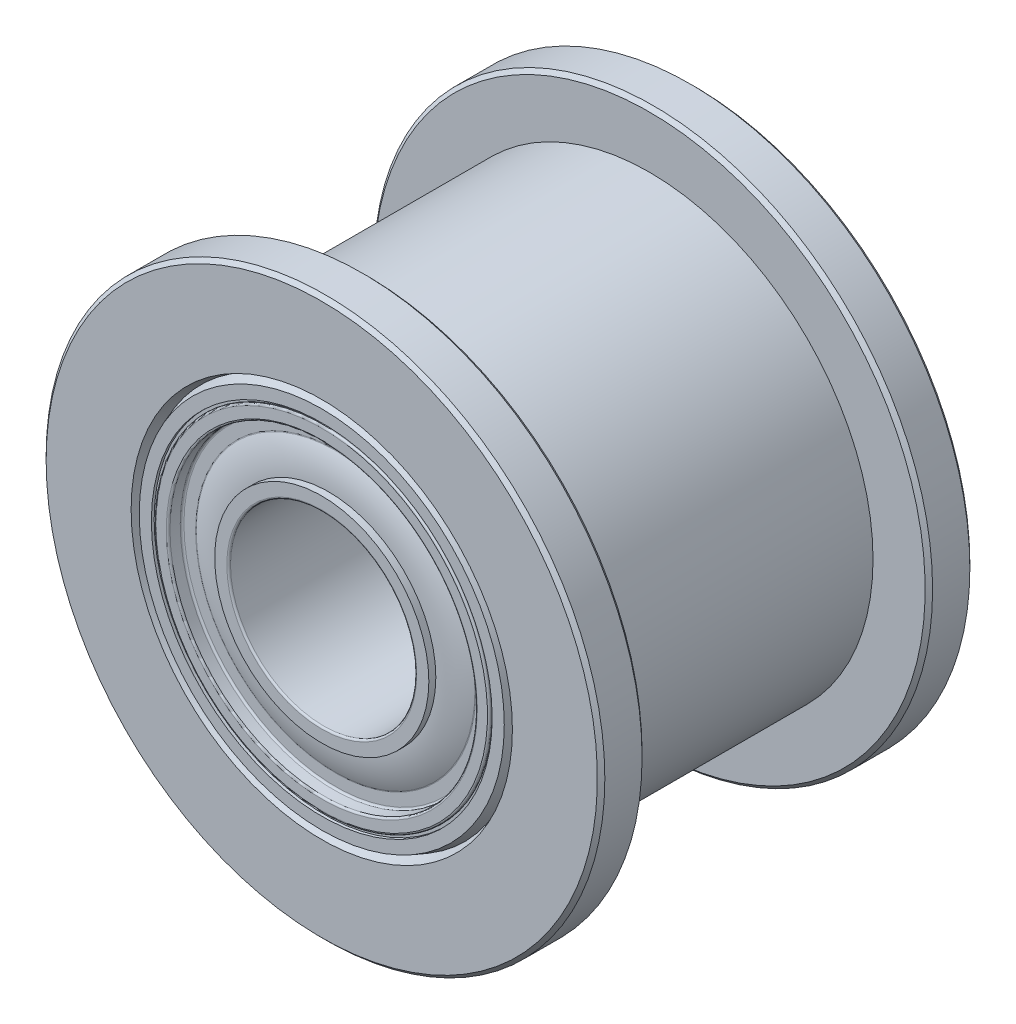
ISO-10303-21;
HEADER;
FILE_DESCRIPTION(('STEP AP214'),'2;1');
FILE_NAME('part.step','',(''),(''),'','','');
FILE_SCHEMA(('AUTOMOTIVE_DESIGN { 1 0 10303 214 1 1 1 1 }'));
ENDSEC;
DATA;
#1=APPLICATION_CONTEXT('core data for automotive mechanical design processes');
#2=APPLICATION_PROTOCOL_DEFINITION('international standard','automotive_design',2000,#1);
#3=PRODUCT_CONTEXT('',#1,'mechanical');
#4=PRODUCT('Part','Part','',(#3));
#5=PRODUCT_RELATED_PRODUCT_CATEGORY('part','',(#4));
#6=PRODUCT_DEFINITION_FORMATION('','',#4);
#7=PRODUCT_DEFINITION_CONTEXT('part definition',#1,'design');
#8=PRODUCT_DEFINITION('design','',#6,#7);
#9=PRODUCT_DEFINITION_SHAPE('','',#8);
#10=(LENGTH_UNIT() NAMED_UNIT(*) SI_UNIT(.MILLI.,.METRE.));
#11=(NAMED_UNIT(*) PLANE_ANGLE_UNIT() SI_UNIT($,.RADIAN.));
#12=(NAMED_UNIT(*) SI_UNIT($,.STERADIAN.) SOLID_ANGLE_UNIT());
#13=UNCERTAINTY_MEASURE_WITH_UNIT(LENGTH_MEASURE(1.E-05),#10,'distance_accuracy_value','');
#14=(GEOMETRIC_REPRESENTATION_CONTEXT(3) GLOBAL_UNCERTAINTY_ASSIGNED_CONTEXT((#13)) GLOBAL_UNIT_ASSIGNED_CONTEXT((#10,
#11,#12)) REPRESENTATION_CONTEXT('',''));
#15=CARTESIAN_POINT('',(0.,0.,0.));
#16=DIRECTION('',(0.,0.,1.));
#17=DIRECTION('',(1.,0.,0.));
#18=AXIS2_PLACEMENT_3D('',#15,#16,#17);
#19=CARTESIAN_POINT('',(0.,7.5,-3.8));
#20=DIRECTION('',(0.,0.,-1.));
#21=DIRECTION('',(-1.,0.,0.));
#22=AXIS2_PLACEMENT_3D('',#19,#20,#21);
#23=PLANE('',#22);
#24=CARTESIAN_POINT('',(0.,0.,-3.8));
#25=DIRECTION('',(0.,0.,-1.));
#26=DIRECTION('',(-1.,0.,0.));
#27=AXIS2_PLACEMENT_3D('',#24,#25,#26);
#28=CIRCLE('',#27,7.40000000000001);
#29=CARTESIAN_POINT('',(-7.4,0.,-3.8));
#30=VERTEX_POINT('',#29);
#31=EDGE_CURVE('E54',#30,#30,#28,.F.);
#32=ORIENTED_EDGE('',*,*,#31,.T.);
#33=EDGE_LOOP('',(#32));
#34=FACE_BOUND('',#33,.T.);
#35=CARTESIAN_POINT('',(0.,0.,-3.8));
#36=DIRECTION('',(0.,0.,1.));
#37=DIRECTION('',(1.,0.,0.));
#38=AXIS2_PLACEMENT_3D('',#35,#36,#37);
#39=CIRCLE('',#38,6.);
#40=CARTESIAN_POINT('',(6.,0.,-3.8));
#41=VERTEX_POINT('',#40);
#42=EDGE_CURVE('E85',#41,#41,#39,.T.);
#43=ORIENTED_EDGE('',*,*,#42,.F.);
#44=EDGE_LOOP('',(#43));
#45=FACE_BOUND('',#44,.T.);
#46=ADVANCED_FACE('F34',(#34,#45),#23,.F.);
#47=CARTESIAN_POINT('',(0.,0.,5.));
#48=DIRECTION('',(0.,0.,1.));
#49=DIRECTION('',(1.,0.,0.));
#50=AXIS2_PLACEMENT_3D('',#47,#48,#49);
#51=CYLINDRICAL_SURFACE('',#50,7.5);
#52=CARTESIAN_POINT('',(0.,0.,-4.9));
#53=DIRECTION('',(0.,0.,1.));
#54=DIRECTION('',(1.,0.,0.));
#55=AXIS2_PLACEMENT_3D('',#52,#53,#54);
#56=CIRCLE('',#55,7.5);
#57=CARTESIAN_POINT('',(7.5,0.,-4.9));
#58=VERTEX_POINT('',#57);
#59=EDGE_CURVE('E60',#58,#58,#56,.T.);
#60=ORIENTED_EDGE('',*,*,#59,.T.);
#61=EDGE_LOOP('',(#60));
#62=FACE_BOUND('',#61,.T.);
#63=CARTESIAN_POINT('',(0.,0.,-3.9));
#64=DIRECTION('',(0.,0.,-1.));
#65=DIRECTION('',(-1.,0.,0.));
#66=AXIS2_PLACEMENT_3D('',#63,#64,#65);
#67=CIRCLE('',#66,7.5);
#68=CARTESIAN_POINT('',(-7.5,0.,-3.9));
#69=VERTEX_POINT('',#68);
#70=EDGE_CURVE('E63',#69,#69,#67,.T.);
#71=ORIENTED_EDGE('',*,*,#70,.T.);
#72=EDGE_LOOP('',(#71));
#73=FACE_BOUND('',#72,.T.);
#74=ADVANCED_FACE('F200',(#62,#73),#51,.T.);
#75=CARTESIAN_POINT('',(0.,7.5,-5.));
#76=DIRECTION('',(0.,0.,1.));
#77=DIRECTION('',(1.,0.,0.));
#78=AXIS2_PLACEMENT_3D('',#75,#76,#77);
#79=PLANE('',#78);
#80=CARTESIAN_POINT('',(0.,0.,-5.));
#81=DIRECTION('',(0.,0.,1.));
#82=DIRECTION('',(1.,0.,0.));
#83=AXIS2_PLACEMENT_3D('',#80,#81,#82);
#84=CIRCLE('',#83,7.4);
#85=CARTESIAN_POINT('',(7.4,0.,-5.));
#86=VERTEX_POINT('',#85);
#87=EDGE_CURVE('E57',#86,#86,#84,.F.);
#88=ORIENTED_EDGE('',*,*,#87,.T.);
#89=EDGE_LOOP('',(#88));
#90=FACE_BOUND('',#89,.T.);
#91=CARTESIAN_POINT('',(0.,0.,-5.));
#92=DIRECTION('',(0.,0.,1.));
#93=DIRECTION('',(1.,0.,0.));
#94=AXIS2_PLACEMENT_3D('',#91,#92,#93);
#95=CIRCLE('',#94,5.11838214055972);
#96=CARTESIAN_POINT('',(5.11838214055972,0.,-5.));
#97=VERTEX_POINT('',#96);
#98=EDGE_CURVE('E66',#97,#97,#95,.T.);
#99=ORIENTED_EDGE('',*,*,#98,.T.);
#100=EDGE_LOOP('',(#99));
#101=FACE_BOUND('',#100,.T.);
#102=ADVANCED_FACE('F206',(#90,#101),#79,.F.);
#103=CARTESIAN_POINT('',(0.,0.,-4.7));
#104=DIRECTION('',(0.,0.,-1.));
#105=DIRECTION('',(-1.,0.,0.));
#106=AXIS2_PLACEMENT_3D('',#103,#104,#105);
#107=CONICAL_SURFACE('',#106,5.00919107027986,0.349065850398864);
#108=ORIENTED_EDGE('',*,*,#98,.F.);
#109=EDGE_LOOP('',(#108));
#110=FACE_BOUND('',#109,.T.);
#111=CARTESIAN_POINT('',(0.,0.,-4.7));
#112=DIRECTION('',(0.,0.,1.));
#113=DIRECTION('',(1.,0.,0.));
#114=AXIS2_PLACEMENT_3D('',#111,#112,#113);
#115=CIRCLE('',#114,5.00919107027986);
#116=CARTESIAN_POINT('',(5.00919107027986,0.,-4.7));
#117=VERTEX_POINT('',#116);
#118=EDGE_CURVE('E69',#117,#117,#115,.T.);
#119=ORIENTED_EDGE('',*,*,#118,.T.);
#120=EDGE_LOOP('',(#119));
#121=FACE_BOUND('',#120,.T.);
#122=ADVANCED_FACE('F282',(#110,#121),#107,.F.);
#123=CARTESIAN_POINT('',(0.,0.,-5.));
#124=DIRECTION('',(0.,0.,1.));
#125=DIRECTION('',(1.,0.,0.));
#126=AXIS2_PLACEMENT_3D('',#123,#124,#125);
#127=CONICAL_SURFACE('',#126,4.9,0.349065850398864);
#128=ORIENTED_EDGE('',*,*,#118,.F.);
#129=EDGE_LOOP('',(#128));
#130=FACE_BOUND('',#129,.T.);
#131=CARTESIAN_POINT('',(0.,0.,-5.));
#132=DIRECTION('',(0.,0.,1.));
#133=DIRECTION('',(1.,0.,0.));
#134=AXIS2_PLACEMENT_3D('',#131,#132,#133);
#135=CIRCLE('',#134,4.9);
#136=CARTESIAN_POINT('',(4.9,0.,-5.));
#137=VERTEX_POINT('',#136);
#138=EDGE_CURVE('E72',#137,#137,#135,.T.);
#139=ORIENTED_EDGE('',*,*,#138,.T.);
#140=EDGE_LOOP('',(#139));
#141=FACE_BOUND('',#140,.T.);
#142=ADVANCED_FACE('F278',(#130,#141),#127,.T.);
#143=CARTESIAN_POINT('',(0.,4.9,-5.));
#144=DIRECTION('',(0.,0.,1.));
#145=DIRECTION('',(1.,0.,0.));
#146=AXIS2_PLACEMENT_3D('',#143,#144,#145);
#147=PLANE('',#146);
#148=ORIENTED_EDGE('',*,*,#138,.F.);
#149=EDGE_LOOP('',(#148));
#150=FACE_BOUND('',#149,.T.);
#151=CARTESIAN_POINT('',(0.,0.,-5.));
#152=DIRECTION('',(0.,0.,1.));
#153=DIRECTION('',(1.,0.,0.));
#154=AXIS2_PLACEMENT_3D('',#151,#152,#153);
#155=CIRCLE('',#154,4.575);
#156=CARTESIAN_POINT('',(4.575,0.,-5.));
#157=VERTEX_POINT('',#156);
#158=EDGE_CURVE('E75',#157,#157,#155,.T.);
#159=ORIENTED_EDGE('',*,*,#158,.T.);
#160=EDGE_LOOP('',(#159));
#161=FACE_BOUND('',#160,.T.);
#162=ADVANCED_FACE('F274',(#150,#161),#147,.F.);
#163=CARTESIAN_POINT('',(0.,0.,5.));
#164=DIRECTION('',(0.,0.,1.));
#165=DIRECTION('',(1.,0.,0.));
#166=AXIS2_PLACEMENT_3D('',#163,#164,#165);
#167=CYLINDRICAL_SURFACE('',#166,4.575);
#168=ORIENTED_EDGE('',*,*,#158,.F.);
#169=EDGE_LOOP('',(#168));
#170=FACE_BOUND('',#169,.T.);
#171=CARTESIAN_POINT('',(0.,0.,-4.925));
#172=DIRECTION('',(0.,0.,1.));
#173=DIRECTION('',(1.,0.,0.));
#174=AXIS2_PLACEMENT_3D('',#171,#172,#173);
#175=CIRCLE('',#174,4.575);
#176=CARTESIAN_POINT('',(4.575,0.,-4.925));
#177=VERTEX_POINT('',#176);
#178=EDGE_CURVE('E78',#177,#177,#175,.T.);
#179=ORIENTED_EDGE('',*,*,#178,.T.);
#180=EDGE_LOOP('',(#179));
#181=FACE_BOUND('',#180,.T.);
#182=ADVANCED_FACE('F270',(#170,#181),#167,.F.);
#183=CARTESIAN_POINT('',(0.,4.5,-4.925));
#184=DIRECTION('',(0.,0.,1.));
#185=DIRECTION('',(1.,0.,0.));
#186=AXIS2_PLACEMENT_3D('',#183,#184,#185);
#187=PLANE('',#186);
#188=ORIENTED_EDGE('',*,*,#178,.F.);
#189=EDGE_LOOP('',(#188));
#190=FACE_BOUND('',#189,.T.);
#191=CARTESIAN_POINT('',(0.,0.,-4.925));
#192=DIRECTION('',(0.,0.,1.));
#193=DIRECTION('',(1.,0.,0.));
#194=AXIS2_PLACEMENT_3D('',#191,#192,#193);
#195=CIRCLE('',#194,4.5);
#196=CARTESIAN_POINT('',(4.5,0.,-4.925));
#197=VERTEX_POINT('',#196);
#198=EDGE_CURVE('E82',#197,#197,#195,.T.);
#199=ORIENTED_EDGE('',*,*,#198,.T.);
#200=EDGE_LOOP('',(#199));
#201=FACE_BOUND('',#200,.T.);
#202=ADVANCED_FACE('F266',(#190,#201),#187,.F.);
#203=CARTESIAN_POINT('',(0.,4.5,4.925));
#204=DIRECTION('',(0.,0.,-1.));
#205=DIRECTION('',(-1.,0.,0.));
#206=AXIS2_PLACEMENT_3D('',#203,#204,#205);
#207=PLANE('',#206);
#208=CARTESIAN_POINT('',(0.,0.,4.925));
#209=DIRECTION('',(0.,0.,1.));
#210=DIRECTION('',(1.,0.,0.));
#211=AXIS2_PLACEMENT_3D('',#208,#209,#210);
#212=CIRCLE('',#211,4.5);
#213=CARTESIAN_POINT('',(4.5,0.,4.925));
#214=VERTEX_POINT('',#213);
#215=EDGE_CURVE('E81',#214,#214,#212,.T.);
#216=ORIENTED_EDGE('',*,*,#215,.F.);
#217=EDGE_LOOP('',(#216));
#218=FACE_BOUND('',#217,.T.);
#219=CARTESIAN_POINT('',(0.,0.,4.925));
#220=DIRECTION('',(0.,0.,1.));
#221=DIRECTION('',(1.,0.,0.));
#222=AXIS2_PLACEMENT_3D('',#219,#220,#221);
#223=CIRCLE('',#222,4.575);
#224=CARTESIAN_POINT('',(4.575,0.,4.925));
#225=VERTEX_POINT('',#224);
#226=EDGE_CURVE('E89',#225,#225,#223,.T.);
#227=ORIENTED_EDGE('',*,*,#226,.T.);
#228=EDGE_LOOP('',(#227));
#229=FACE_BOUND('',#228,.T.);
#230=ADVANCED_FACE('F262',(#218,#229),#207,.F.);
#231=CARTESIAN_POINT('',(0.,0.,5.));
#232=DIRECTION('',(0.,0.,1.));
#233=DIRECTION('',(1.,0.,0.));
#234=AXIS2_PLACEMENT_3D('',#231,#232,#233);
#235=CYLINDRICAL_SURFACE('',#234,4.575);
#236=ORIENTED_EDGE('',*,*,#226,.F.);
#237=EDGE_LOOP('',(#236));
#238=FACE_BOUND('',#237,.T.);
#239=CARTESIAN_POINT('',(0.,0.,5.));
#240=DIRECTION('',(0.,0.,1.));
#241=DIRECTION('',(1.,0.,0.));
#242=AXIS2_PLACEMENT_3D('',#239,#240,#241);
#243=CIRCLE('',#242,4.575);
#244=CARTESIAN_POINT('',(4.575,0.,5.));
#245=VERTEX_POINT('',#244);
#246=EDGE_CURVE('E92',#245,#245,#243,.T.);
#247=ORIENTED_EDGE('',*,*,#246,.T.);
#248=EDGE_LOOP('',(#247));
#249=FACE_BOUND('',#248,.T.);
#250=ADVANCED_FACE('F258',(#238,#249),#235,.F.);
#251=CARTESIAN_POINT('',(0.,4.9,5.));
#252=DIRECTION('',(0.,0.,-1.));
#253=DIRECTION('',(-1.,0.,0.));
#254=AXIS2_PLACEMENT_3D('',#251,#252,#253);
#255=PLANE('',#254);
#256=ORIENTED_EDGE('',*,*,#246,.F.);
#257=EDGE_LOOP('',(#256));
#258=FACE_BOUND('',#257,.T.);
#259=CARTESIAN_POINT('',(0.,0.,5.));
#260=DIRECTION('',(0.,0.,1.));
#261=DIRECTION('',(1.,0.,0.));
#262=AXIS2_PLACEMENT_3D('',#259,#260,#261);
#263=CIRCLE('',#262,4.9);
#264=CARTESIAN_POINT('',(4.9,0.,5.));
#265=VERTEX_POINT('',#264);
#266=EDGE_CURVE('E95',#265,#265,#263,.T.);
#267=ORIENTED_EDGE('',*,*,#266,.T.);
#268=EDGE_LOOP('',(#267));
#269=FACE_BOUND('',#268,.T.);
#270=ADVANCED_FACE('F254',(#258,#269),#255,.F.);
#271=CARTESIAN_POINT('',(0.,0.,4.7));
#272=DIRECTION('',(0.,0.,-1.));
#273=DIRECTION('',(-1.,0.,0.));
#274=AXIS2_PLACEMENT_3D('',#271,#272,#273);
#275=CONICAL_SURFACE('',#274,5.00919107027986,0.349065850398864);
#276=ORIENTED_EDGE('',*,*,#266,.F.);
#277=EDGE_LOOP('',(#276));
#278=FACE_BOUND('',#277,.T.);
#279=CARTESIAN_POINT('',(0.,0.,4.7));
#280=DIRECTION('',(0.,0.,1.));
#281=DIRECTION('',(1.,0.,0.));
#282=AXIS2_PLACEMENT_3D('',#279,#280,#281);
#283=CIRCLE('',#282,5.00919107027986);
#284=CARTESIAN_POINT('',(5.00919107027986,0.,4.7));
#285=VERTEX_POINT('',#284);
#286=EDGE_CURVE('E98',#285,#285,#283,.T.);
#287=ORIENTED_EDGE('',*,*,#286,.T.);
#288=EDGE_LOOP('',(#287));
#289=FACE_BOUND('',#288,.T.);
#290=ADVANCED_FACE('F250',(#278,#289),#275,.T.);
#291=CARTESIAN_POINT('',(0.,0.,5.));
#292=DIRECTION('',(0.,0.,1.));
#293=DIRECTION('',(1.,0.,0.));
#294=AXIS2_PLACEMENT_3D('',#291,#292,#293);
#295=CONICAL_SURFACE('',#294,5.11838214055972,0.349065850398864);
#296=ORIENTED_EDGE('',*,*,#286,.F.);
#297=EDGE_LOOP('',(#296));
#298=FACE_BOUND('',#297,.T.);
#299=CARTESIAN_POINT('',(0.,0.,5.));
#300=DIRECTION('',(0.,0.,1.));
#301=DIRECTION('',(1.,0.,0.));
#302=AXIS2_PLACEMENT_3D('',#299,#300,#301);
#303=CIRCLE('',#302,5.11838214055972);
#304=CARTESIAN_POINT('',(5.11838214055972,0.,5.));
#305=VERTEX_POINT('',#304);
#306=EDGE_CURVE('E101',#305,#305,#303,.T.);
#307=ORIENTED_EDGE('',*,*,#306,.T.);
#308=EDGE_LOOP('',(#307));
#309=FACE_BOUND('',#308,.T.);
#310=ADVANCED_FACE('F244',(#298,#309),#295,.F.);
#311=CARTESIAN_POINT('',(0.,7.5,5.));
#312=DIRECTION('',(0.,0.,-1.));
#313=DIRECTION('',(-1.,0.,0.));
#314=AXIS2_PLACEMENT_3D('',#311,#312,#313);
#315=PLANE('',#314);
#316=CARTESIAN_POINT('',(0.,0.,5.));
#317=DIRECTION('',(0.,0.,-1.));
#318=DIRECTION('',(-1.,0.,0.));
#319=AXIS2_PLACEMENT_3D('',#316,#317,#318);
#320=CIRCLE('',#319,7.4);
#321=CARTESIAN_POINT('',(-7.4,0.,5.));
#322=VERTEX_POINT('',#321);
#323=EDGE_CURVE('E10',#322,#322,#320,.F.);
#324=ORIENTED_EDGE('',*,*,#323,.T.);
#325=EDGE_LOOP('',(#324));
#326=FACE_BOUND('',#325,.T.);
#327=ORIENTED_EDGE('',*,*,#306,.F.);
#328=EDGE_LOOP('',(#327));
#329=FACE_BOUND('',#328,.T.);
#330=ADVANCED_FACE('F235',(#326,#329),#315,.F.);
#331=CARTESIAN_POINT('',(0.,0.,5.));
#332=DIRECTION('',(0.,0.,1.));
#333=DIRECTION('',(1.,0.,0.));
#334=AXIS2_PLACEMENT_3D('',#331,#332,#333);
#335=CYLINDRICAL_SURFACE('',#334,7.5);
#336=CARTESIAN_POINT('',(0.,0.,3.9));
#337=DIRECTION('',(0.,0.,1.));
#338=DIRECTION('',(1.,0.,0.));
#339=AXIS2_PLACEMENT_3D('',#336,#337,#338);
#340=CIRCLE('',#339,7.5);
#341=CARTESIAN_POINT('',(7.5,0.,3.9));
#342=VERTEX_POINT('',#341);
#343=EDGE_CURVE('E45',#342,#342,#340,.T.);
#344=ORIENTED_EDGE('',*,*,#343,.T.);
#345=EDGE_LOOP('',(#344));
#346=FACE_BOUND('',#345,.T.);
#347=CARTESIAN_POINT('',(0.,0.,4.9));
#348=DIRECTION('',(0.,0.,-1.));
#349=DIRECTION('',(-1.,0.,0.));
#350=AXIS2_PLACEMENT_3D('',#347,#348,#349);
#351=CIRCLE('',#350,7.5);
#352=CARTESIAN_POINT('',(-7.5,0.,4.9));
#353=VERTEX_POINT('',#352);
#354=EDGE_CURVE('E49',#353,#353,#351,.T.);
#355=ORIENTED_EDGE('',*,*,#354,.T.);
#356=EDGE_LOOP('',(#355));
#357=FACE_BOUND('',#356,.T.);
#358=ADVANCED_FACE('F231',(#346,#357),#335,.T.);
#359=CARTESIAN_POINT('',(0.,7.5,3.8));
#360=DIRECTION('',(0.,0.,1.));
#361=DIRECTION('',(1.,0.,0.));
#362=AXIS2_PLACEMENT_3D('',#359,#360,#361);
#363=PLANE('',#362);
#364=CARTESIAN_POINT('',(0.,0.,3.8));
#365=DIRECTION('',(0.,0.,1.));
#366=DIRECTION('',(1.,0.,0.));
#367=AXIS2_PLACEMENT_3D('',#364,#365,#366);
#368=CIRCLE('',#367,7.4);
#369=CARTESIAN_POINT('',(7.4,0.,3.8));
#370=VERTEX_POINT('',#369);
#371=EDGE_CURVE('E41',#370,#370,#368,.F.);
#372=ORIENTED_EDGE('',*,*,#371,.T.);
#373=EDGE_LOOP('',(#372));
#374=FACE_BOUND('',#373,.T.);
#375=CARTESIAN_POINT('',(0.,0.,3.8));
#376=DIRECTION('',(0.,0.,1.));
#377=DIRECTION('',(1.,0.,0.));
#378=AXIS2_PLACEMENT_3D('',#375,#376,#377);
#379=CIRCLE('',#378,6.);
#380=CARTESIAN_POINT('',(6.,0.,3.8));
#381=VERTEX_POINT('',#380);
#382=EDGE_CURVE('E104',#381,#381,#379,.T.);
#383=ORIENTED_EDGE('',*,*,#382,.T.);
#384=EDGE_LOOP('',(#383));
#385=FACE_BOUND('',#384,.T.);
#386=ADVANCED_FACE('F234',(#374,#385),#363,.F.);
#387=CARTESIAN_POINT('',(0.,0.,5.));
#388=DIRECTION('',(0.,0.,1.));
#389=DIRECTION('',(1.,0.,0.));
#390=AXIS2_PLACEMENT_3D('',#387,#388,#389);
#391=CYLINDRICAL_SURFACE('',#390,6.);
#392=ORIENTED_EDGE('',*,*,#382,.F.);
#393=EDGE_LOOP('',(#392));
#394=FACE_BOUND('',#393,.T.);
#395=ORIENTED_EDGE('',*,*,#42,.T.);
#396=EDGE_LOOP('',(#395));
#397=FACE_BOUND('',#396,.T.);
#398=ADVANCED_FACE('F216',(#394,#397),#391,.T.);
#399=CARTESIAN_POINT('',(0.,0.,-4.9));
#400=DIRECTION('',(0.,0.,1.));
#401=DIRECTION('',(1.,0.,0.));
#402=AXIS2_PLACEMENT_3D('',#399,#400,#401);
#403=CONICAL_SURFACE('',#402,7.5,0.785398163397461);
#404=ORIENTED_EDGE('',*,*,#87,.F.);
#405=EDGE_LOOP('',(#404));
#406=FACE_BOUND('',#405,.T.);
#407=ORIENTED_EDGE('',*,*,#59,.F.);
#408=EDGE_LOOP('',(#407));
#409=FACE_BOUND('',#408,.T.);
#410=ADVANCED_FACE('F212',(#406,#409),#403,.T.);
#411=CARTESIAN_POINT('',(0.,0.,-3.8));
#412=DIRECTION('',(0.,0.,-1.));
#413=DIRECTION('',(-1.,0.,0.));
#414=AXIS2_PLACEMENT_3D('',#411,#412,#413);
#415=CONICAL_SURFACE('',#414,7.4,0.785398163397453);
#416=CARTESIAN_POINT('',(-7.5,0.,-3.9));
#417=CARTESIAN_POINT('',(-7.49895833333333,0.,-3.89895833333333));
#418=CARTESIAN_POINT('',(-7.49791666666667,0.,-3.89791666666666));
#419=CARTESIAN_POINT('',(-7.49583333333333,0.,-3.89583333333333));
#420=CARTESIAN_POINT('',(-7.49479166666667,0.,-3.89479166666666));
#421=CARTESIAN_POINT('',(-7.49270833333333,0.,-3.89270833333333));
#422=CARTESIAN_POINT('',(-7.49166666666667,0.,-3.89166666666666));
#423=CARTESIAN_POINT('',(-7.48958333333333,0.,-3.88958333333333));
#424=CARTESIAN_POINT('',(-7.48854166666667,0.,-3.88854166666666));
#425=CARTESIAN_POINT('',(-7.48645833333333,0.,-3.88645833333333));
#426=CARTESIAN_POINT('',(-7.48541666666667,0.,-3.88541666666666));
#427=CARTESIAN_POINT('',(-7.48333333333333,0.,-3.88333333333333));
#428=CARTESIAN_POINT('',(-7.48229166666667,0.,-3.88229166666666));
#429=CARTESIAN_POINT('',(-7.48020833333333,0.,-3.88020833333333));
#430=CARTESIAN_POINT('',(-7.47916666666667,0.,-3.87916666666666));
#431=CARTESIAN_POINT('',(-7.47708333333333,0.,-3.87708333333333));
#432=CARTESIAN_POINT('',(-7.47604166666667,0.,-3.87604166666666));
#433=CARTESIAN_POINT('',(-7.47395833333333,0.,-3.87395833333333));
#434=CARTESIAN_POINT('',(-7.47291666666667,0.,-3.87291666666666));
#435=CARTESIAN_POINT('',(-7.47083333333333,0.,-3.87083333333333));
#436=CARTESIAN_POINT('',(-7.46979166666667,0.,-3.86979166666666));
#437=CARTESIAN_POINT('',(-7.46770833333334,0.,-3.86770833333333));
#438=CARTESIAN_POINT('',(-7.46666666666667,0.,-3.86666666666666));
#439=CARTESIAN_POINT('',(-7.46458333333334,0.,-3.86458333333333));
#440=CARTESIAN_POINT('',(-7.46354166666667,0.,-3.86354166666666));
#441=CARTESIAN_POINT('',(-7.46145833333333,0.,-3.86145833333333));
#442=CARTESIAN_POINT('',(-7.46041666666667,0.,-3.86041666666667));
#443=CARTESIAN_POINT('',(-7.45833333333333,0.,-3.85833333333333));
#444=CARTESIAN_POINT('',(-7.45729166666667,0.,-3.85729166666667));
#445=CARTESIAN_POINT('',(-7.45520833333333,0.,-3.85520833333333));
#446=CARTESIAN_POINT('',(-7.45416666666667,0.,-3.85416666666667));
#447=CARTESIAN_POINT('',(-7.45208333333334,0.,-3.85208333333333));
#448=CARTESIAN_POINT('',(-7.45104166666667,0.,-3.85104166666667));
#449=CARTESIAN_POINT('',(-7.44895833333334,0.,-3.84895833333333));
#450=CARTESIAN_POINT('',(-7.44791666666667,0.,-3.84791666666667));
#451=CARTESIAN_POINT('',(-7.44583333333334,0.,-3.84583333333333));
#452=CARTESIAN_POINT('',(-7.44479166666667,0.,-3.84479166666667));
#453=CARTESIAN_POINT('',(-7.44270833333334,0.,-3.84270833333333));
#454=CARTESIAN_POINT('',(-7.44166666666667,0.,-3.84166666666667));
#455=CARTESIAN_POINT('',(-7.43958333333334,0.,-3.83958333333333));
#456=CARTESIAN_POINT('',(-7.43854166666667,0.,-3.83854166666667));
#457=CARTESIAN_POINT('',(-7.43645833333334,0.,-3.83645833333333));
#458=CARTESIAN_POINT('',(-7.43541666666667,0.,-3.83541666666667));
#459=CARTESIAN_POINT('',(-7.43333333333334,0.,-3.83333333333333));
#460=CARTESIAN_POINT('',(-7.43229166666667,0.,-3.83229166666667));
#461=CARTESIAN_POINT('',(-7.43020833333334,0.,-3.83020833333333));
#462=CARTESIAN_POINT('',(-7.42916666666667,0.,-3.82916666666667));
#463=CARTESIAN_POINT('',(-7.42708333333334,0.,-3.82708333333333));
#464=CARTESIAN_POINT('',(-7.42604166666667,0.,-3.82604166666667));
#465=CARTESIAN_POINT('',(-7.42395833333334,0.,-3.82395833333333));
#466=CARTESIAN_POINT('',(-7.42291666666667,0.,-3.82291666666667));
#467=CARTESIAN_POINT('',(-7.42083333333334,0.,-3.82083333333333));
#468=CARTESIAN_POINT('',(-7.41979166666667,0.,-3.81979166666667));
#469=CARTESIAN_POINT('',(-7.41770833333334,0.,-3.81770833333333));
#470=CARTESIAN_POINT('',(-7.41666666666667,0.,-3.81666666666667));
#471=CARTESIAN_POINT('',(-7.41458333333334,0.,-3.81458333333333));
#472=CARTESIAN_POINT('',(-7.41354166666667,0.,-3.81354166666667));
#473=CARTESIAN_POINT('',(-7.41145833333334,0.,-3.81145833333334));
#474=CARTESIAN_POINT('',(-7.41041666666667,0.,-3.81041666666667));
#475=CARTESIAN_POINT('',(-7.40833333333334,0.,-3.80833333333334));
#476=CARTESIAN_POINT('',(-7.40729166666667,0.,-3.80729166666667));
#477=CARTESIAN_POINT('',(-7.40520833333334,0.,-3.80520833333334));
#478=CARTESIAN_POINT('',(-7.40416666666667,0.,-3.80416666666667));
#479=CARTESIAN_POINT('',(-7.40208333333334,0.,-3.80208333333334));
#480=CARTESIAN_POINT('',(-7.40104166666667,0.,-3.80104166666667));
#481=CARTESIAN_POINT('',(-7.4,0.,-3.8));
#482=B_SPLINE_CURVE_WITH_KNOTS('',3,(#416,#417,#418,#419,#420,#421,#422,#423,#424,#425,#426,
#427,#428,#429,#430,#431,#432,#433,#434,#435,#436,#437,#438,#439,#440,#441,#442,#443,#444,#445,
#446,#447,#448,#449,#450,#451,#452,#453,#454,#455,#456,#457,#458,#459,#460,#461,#462,#463,#464,
#465,#466,#467,#468,#469,#470,#471,#472,#473,#474,#475,#476,#477,#478,#479,#480,#481),
.UNSPECIFIED.,.F.,.F.,(4,2,2,2,2,2,2,2,2,2,2,2,2,2,2,2,2,2,2,2,2,2,2,2,2,2,2,2,2,2,2,2,4),(0.,
0.00441941738241544,0.00883883476483148,0.0132582521472472,0.0176776695296627,
0.0220970869120781,0.0265165042944938,0.0309359216769099,0.0353553390593253,0.0397747564417411,
0.0441941738241565,0.0486135912065719,0.0530330085889883,0.0574524259714037,0.0618718433538192,
0.0662912607362349,0.0707106781186503,0.0751300955010664,0.0795495128834821,0.0839689302658976,
0.088388347648313,0.0928077650307294,0.0972271824131448,0.10164659979556,0.106066017177976,
0.110485434560391,0.114904851942807,0.119324269325223,0.123743686707639,0.128163104090054,
0.13258252147247,0.137001938854886,0.141421356237302),.UNSPECIFIED.);
#483=EDGE_CURVE('BSEAM215',#69,#30,#482,.T.);
#484=ORIENTED_EDGE('',*,*,#70,.F.);
#485=ORIENTED_EDGE('',*,*,#31,.F.);
#486=ORIENTED_EDGE('',*,*,#483,.T.);
#487=ORIENTED_EDGE('',*,*,#483,.F.);
#488=EDGE_LOOP('',(#484,#486,#485,#487));
#489=FACE_BOUND('',#488,.T.);
#490=ADVANCED_FACE('F215',(#489),#415,.T.);
#491=CARTESIAN_POINT('',(0.,0.,3.9));
#492=DIRECTION('',(0.,0.,1.));
#493=DIRECTION('',(1.,0.,0.));
#494=AXIS2_PLACEMENT_3D('',#491,#492,#493);
#495=CONICAL_SURFACE('',#494,7.5,0.785398163397453);
#496=ORIENTED_EDGE('',*,*,#371,.F.);
#497=EDGE_LOOP('',(#496));
#498=FACE_BOUND('',#497,.T.);
#499=ORIENTED_EDGE('',*,*,#343,.F.);
#500=EDGE_LOOP('',(#499));
#501=FACE_BOUND('',#500,.T.);
#502=ADVANCED_FACE('F219',(#498,#501),#495,.T.);
#503=CARTESIAN_POINT('',(0.,0.,5.));
#504=DIRECTION('',(0.,0.,-1.));
#505=DIRECTION('',(-1.,0.,0.));
#506=AXIS2_PLACEMENT_3D('',#503,#504,#505);
#507=CONICAL_SURFACE('',#506,7.4,0.785398163397457);
#508=ORIENTED_EDGE('',*,*,#354,.F.);
#509=EDGE_LOOP('',(#508));
#510=FACE_BOUND('',#509,.T.);
#511=ORIENTED_EDGE('',*,*,#323,.F.);
#512=EDGE_LOOP('',(#511));
#513=FACE_BOUND('',#512,.T.);
#514=ADVANCED_FACE('F36',(#510,#513),#507,.T.);
#515=CARTESIAN_POINT('',(0.,0.,5.));
#516=DIRECTION('',(0.,0.,1.));
#517=DIRECTION('',(1.,0.,0.));
#518=AXIS2_PLACEMENT_3D('',#515,#516,#517);
#519=CYLINDRICAL_SURFACE('',#518,4.5);
#520=CARTESIAN_POINT('',(0.,0.,4.95));
#521=DIRECTION('',(0.,0.,-1.));
#522=DIRECTION('',(-1.,0.,0.));
#523=AXIS2_PLACEMENT_3D('',#520,#521,#522);
#524=CIRCLE('',#523,4.5);
#525=CARTESIAN_POINT('',(-4.5,0.,4.95));
#526=VERTEX_POINT('',#525);
#527=EDGE_CURVE('E150',#526,#526,#524,.T.);
#528=ORIENTED_EDGE('',*,*,#527,.T.);
#529=EDGE_LOOP('',(#528));
#530=FACE_BOUND('',#529,.T.);
#531=ORIENTED_EDGE('',*,*,#215,.T.);
#532=EDGE_LOOP('',(#531));
#533=FACE_BOUND('',#532,.T.);
#534=ADVANCED_FACE('F226',(#530,#533),#519,.T.);
#535=CARTESIAN_POINT('',(0.,2.5,-5.));
#536=DIRECTION('',(0.,0.,1.));
#537=DIRECTION('',(1.,0.,0.));
#538=AXIS2_PLACEMENT_3D('',#535,#536,#537);
#539=PLANE('',#538);
#540=CARTESIAN_POINT('',(0.,0.,-5.));
#541=DIRECTION('',(0.,0.,1.));
#542=DIRECTION('',(1.,0.,0.));
#543=AXIS2_PLACEMENT_3D('',#540,#541,#542);
#544=CIRCLE('',#543,2.55);
#545=CARTESIAN_POINT('',(2.55,0.,-5.));
#546=VERTEX_POINT('',#545);
#547=EDGE_CURVE('E162',#546,#546,#544,.T.);
#548=ORIENTED_EDGE('',*,*,#547,.T.);
#549=EDGE_LOOP('',(#548));
#550=FACE_BOUND('',#549,.T.);
#551=CARTESIAN_POINT('',(0.,0.,-5.));
#552=DIRECTION('',(0.,0.,1.));
#553=DIRECTION('',(1.,0.,0.));
#554=AXIS2_PLACEMENT_3D('',#551,#552,#553);
#555=CIRCLE('',#554,2.825);
#556=CARTESIAN_POINT('',(2.825,0.,-5.));
#557=VERTEX_POINT('',#556);
#558=EDGE_CURVE('E165',#557,#557,#555,.F.);
#559=ORIENTED_EDGE('',*,*,#558,.T.);
#560=EDGE_LOOP('',(#559));
#561=FACE_BOUND('',#560,.T.);
#562=ADVANCED_FACE('F470',(#550,#561),#539,.F.);
#563=CARTESIAN_POINT('',(0.,0.,5.));
#564=DIRECTION('',(0.,0.,1.));
#565=DIRECTION('',(1.,0.,0.));
#566=AXIS2_PLACEMENT_3D('',#563,#564,#565);
#567=CYLINDRICAL_SURFACE('',#566,2.5);
#568=CARTESIAN_POINT('',(0.,0.,-4.95));
#569=DIRECTION('',(0.,0.,1.));
#570=DIRECTION('',(1.,0.,0.));
#571=AXIS2_PLACEMENT_3D('',#568,#569,#570);
#572=CIRCLE('',#571,2.5);
#573=CARTESIAN_POINT('',(2.5,0.,-4.95));
#574=VERTEX_POINT('',#573);
#575=EDGE_CURVE('E156',#574,#574,#572,.F.);
#576=ORIENTED_EDGE('',*,*,#575,.T.);
#577=EDGE_LOOP('',(#576));
#578=FACE_BOUND('',#577,.T.);
#579=CARTESIAN_POINT('',(0.,0.,4.95));
#580=DIRECTION('',(0.,0.,-1.));
#581=DIRECTION('',(-1.,0.,0.));
#582=AXIS2_PLACEMENT_3D('',#579,#580,#581);
#583=CIRCLE('',#582,2.5);
#584=CARTESIAN_POINT('',(-2.5,0.,4.95));
#585=VERTEX_POINT('',#584);
#586=EDGE_CURVE('E159',#585,#585,#583,.F.);
#587=ORIENTED_EDGE('',*,*,#586,.T.);
#588=EDGE_LOOP('',(#587));
#589=FACE_BOUND('',#588,.T.);
#590=ADVANCED_FACE('F308',(#578,#589),#567,.F.);
#591=ORIENTED_EDGE('',*,*,#198,.F.);
#592=EDGE_LOOP('',(#591));
#593=FACE_BOUND('',#592,.T.);
#594=CARTESIAN_POINT('',(0.,0.,-4.95));
#595=DIRECTION('',(0.,0.,1.));
#596=DIRECTION('',(1.,0.,0.));
#597=AXIS2_PLACEMENT_3D('',#594,#595,#596);
#598=CIRCLE('',#597,4.5);
#599=CARTESIAN_POINT('',(4.5,0.,-4.95));
#600=VERTEX_POINT('',#599);
#601=EDGE_CURVE('E147',#600,#600,#598,.T.);
#602=ORIENTED_EDGE('',*,*,#601,.T.);
#603=EDGE_LOOP('',(#602));
#604=FACE_BOUND('',#603,.T.);
#605=ADVANCED_FACE('F304',(#593,#604),#519,.T.);
#606=CARTESIAN_POINT('',(0.,4.5,-5.));
#607=DIRECTION('',(0.,0.,1.));
#608=DIRECTION('',(1.,0.,0.));
#609=AXIS2_PLACEMENT_3D('',#606,#607,#608);
#610=PLANE('',#609);
#611=CARTESIAN_POINT('',(0.,0.,-5.));
#612=DIRECTION('',(0.,0.,1.));
#613=DIRECTION('',(1.,0.,0.));
#614=AXIS2_PLACEMENT_3D('',#611,#612,#613);
#615=CIRCLE('',#614,4.45);
#616=CARTESIAN_POINT('',(4.45,0.,-5.));
#617=VERTEX_POINT('',#616);
#618=EDGE_CURVE('E141',#617,#617,#615,.F.);
#619=ORIENTED_EDGE('',*,*,#618,.T.);
#620=EDGE_LOOP('',(#619));
#621=FACE_BOUND('',#620,.T.);
#622=CARTESIAN_POINT('',(0.,0.,-5.));
#623=DIRECTION('',(0.,0.,1.));
#624=DIRECTION('',(1.,0.,0.));
#625=AXIS2_PLACEMENT_3D('',#622,#623,#624);
#626=CIRCLE('',#625,4.175);
#627=CARTESIAN_POINT('',(4.175,0.,-5.));
#628=VERTEX_POINT('',#627);
#629=EDGE_CURVE('E144',#628,#628,#626,.T.);
#630=ORIENTED_EDGE('',*,*,#629,.T.);
#631=EDGE_LOOP('',(#630));
#632=FACE_BOUND('',#631,.T.);
#633=ADVANCED_FACE('F307',(#621,#632),#610,.F.);
#634=CARTESIAN_POINT('',(0.,0.,5.));
#635=DIRECTION('',(0.,0.,1.));
#636=DIRECTION('',(1.,0.,0.));
#637=AXIS2_PLACEMENT_3D('',#634,#635,#636);
#638=CYLINDRICAL_SURFACE('',#637,4.125);
#639=CARTESIAN_POINT('',(0.,0.,-4.95));
#640=DIRECTION('',(0.,0.,1.));
#641=DIRECTION('',(1.,0.,0.));
#642=AXIS2_PLACEMENT_3D('',#639,#640,#641);
#643=CIRCLE('',#642,4.125);
#644=CARTESIAN_POINT('',(4.125,0.,-4.95));
#645=VERTEX_POINT('',#644);
#646=EDGE_CURVE('E132',#645,#645,#643,.F.);
#647=ORIENTED_EDGE('',*,*,#646,.T.);
#648=EDGE_LOOP('',(#647));
#649=FACE_BOUND('',#648,.T.);
#650=CARTESIAN_POINT('',(0.,0.,-4.625));
#651=DIRECTION('',(0.,0.,1.));
#652=DIRECTION('',(1.,0.,0.));
#653=AXIS2_PLACEMENT_3D('',#650,#651,#652);
#654=CIRCLE('',#653,4.125);
#655=CARTESIAN_POINT('',(4.125,0.,-4.625));
#656=VERTEX_POINT('',#655);
#657=EDGE_CURVE('E168',#656,#656,#654,.T.);
#658=ORIENTED_EDGE('',*,*,#657,.T.);
#659=EDGE_LOOP('',(#658));
#660=FACE_BOUND('',#659,.T.);
#661=ADVANCED_FACE('F506',(#649,#660),#638,.F.);
#662=CARTESIAN_POINT('',(0.,3.75,-4.625));
#663=DIRECTION('',(0.,0.,1.));
#664=DIRECTION('',(1.,0.,0.));
#665=AXIS2_PLACEMENT_3D('',#662,#663,#664);
#666=PLANE('',#665);
#667=CARTESIAN_POINT('',(0.,0.,-4.625));
#668=DIRECTION('',(0.,0.,1.));
#669=DIRECTION('',(1.,0.,0.));
#670=AXIS2_PLACEMENT_3D('',#667,#668,#669);
#671=CIRCLE('',#670,3.76064947919592);
#672=CARTESIAN_POINT('',(3.76064947919592,0.,-4.625));
#673=VERTEX_POINT('',#672);
#674=EDGE_CURVE('E138',#673,#673,#671,.T.);
#675=ORIENTED_EDGE('',*,*,#674,.T.);
#676=EDGE_LOOP('',(#675));
#677=FACE_BOUND('',#676,.T.);
#678=ORIENTED_EDGE('',*,*,#657,.F.);
#679=EDGE_LOOP('',(#678));
#680=FACE_BOUND('',#679,.T.);
#681=ADVANCED_FACE('F516',(#677,#680),#666,.F.);
#682=CARTESIAN_POINT('',(0.,0.,-2.67708333333336));
#683=DIRECTION('',(0.,0.,1.));
#684=DIRECTION('',(1.,0.,0.));
#685=AXIS2_PLACEMENT_3D('',#682,#683,#684);
#686=TOROIDAL_SURFACE('',#685,2.875,2.13541666666664);
#687=CARTESIAN_POINT('',(0.,0.,-4.62928979980935));
#688=DIRECTION('',(0.,0.,1.));
#689=DIRECTION('',(1.,0.,0.));
#690=AXIS2_PLACEMENT_3D('',#687,#688,#689);
#691=CIRCLE('',#690,3.74038676470526);
#692=CARTESIAN_POINT('',(3.74038676470526,0.,-4.62928979980935));
#693=VERTEX_POINT('',#692);
#694=EDGE_CURVE('E135',#693,#693,#691,.F.);
#695=ORIENTED_EDGE('',*,*,#694,.T.);
#696=EDGE_LOOP('',(#695));
#697=FACE_BOUND('',#696,.T.);
#698=CARTESIAN_POINT('',(0.,0.,-4.81250000000001));
#699=DIRECTION('',(0.,0.,1.));
#700=DIRECTION('',(1.,0.,0.));
#701=AXIS2_PLACEMENT_3D('',#698,#699,#700);
#702=CIRCLE('',#701,2.875);
#703=CARTESIAN_POINT('',(2.875,0.,-4.81250000000001));
#704=VERTEX_POINT('',#703);
#705=EDGE_CURVE('E171',#704,#704,#702,.T.);
#706=ORIENTED_EDGE('',*,*,#705,.T.);
#707=EDGE_LOOP('',(#706));
#708=FACE_BOUND('',#707,.T.);
#709=ADVANCED_FACE('F526',(#697,#708),#686,.T.);
#710=CARTESIAN_POINT('',(0.,0.,5.));
#711=DIRECTION('',(0.,0.,1.));
#712=DIRECTION('',(1.,0.,0.));
#713=AXIS2_PLACEMENT_3D('',#710,#711,#712);
#714=CYLINDRICAL_SURFACE('',#713,2.875);
#715=CARTESIAN_POINT('',(0.,0.,-4.95));
#716=DIRECTION('',(0.,0.,1.));
#717=DIRECTION('',(1.,0.,0.));
#718=AXIS2_PLACEMENT_3D('',#715,#716,#717);
#719=CIRCLE('',#718,2.875);
#720=CARTESIAN_POINT('',(2.875,0.,-4.95));
#721=VERTEX_POINT('',#720);
#722=EDGE_CURVE('E153',#721,#721,#719,.T.);
#723=ORIENTED_EDGE('',*,*,#722,.T.);
#724=EDGE_LOOP('',(#723));
#725=FACE_BOUND('',#724,.T.);
#726=ORIENTED_EDGE('',*,*,#705,.F.);
#727=EDGE_LOOP('',(#726));
#728=FACE_BOUND('',#727,.T.);
#729=ADVANCED_FACE('F536',(#725,#728),#714,.T.);
#730=CARTESIAN_POINT('',(0.,2.5,5.));
#731=DIRECTION('',(0.,0.,-1.));
#732=DIRECTION('',(1.,0.,0.));
#733=AXIS2_PLACEMENT_3D('',#730,#731,#732);
#734=PLANE('',#733);
#735=CARTESIAN_POINT('',(0.,0.,5.));
#736=DIRECTION('',(0.,0.,-1.));
#737=DIRECTION('',(-1.,0.,0.));
#738=AXIS2_PLACEMENT_3D('',#735,#736,#737);
#739=CIRCLE('',#738,2.55);
#740=CARTESIAN_POINT('',(-2.55,0.,5.));
#741=VERTEX_POINT('',#740);
#742=EDGE_CURVE('E86',#741,#741,#739,.T.);
#743=ORIENTED_EDGE('',*,*,#742,.T.);
#744=EDGE_LOOP('',(#743));
#745=FACE_BOUND('',#744,.T.);
#746=CARTESIAN_POINT('',(0.,0.,5.));
#747=DIRECTION('',(0.,0.,1.));
#748=DIRECTION('',(1.,0.,0.));
#749=AXIS2_PLACEMENT_3D('',#746,#747,#748);
#750=CIRCLE('',#749,2.875);
#751=CARTESIAN_POINT('',(2.875,0.,5.));
#752=VERTEX_POINT('',#751);
#753=EDGE_CURVE('E177',#752,#752,#750,.T.);
#754=ORIENTED_EDGE('',*,*,#753,.T.);
#755=EDGE_LOOP('',(#754));
#756=FACE_BOUND('',#755,.T.);
#757=ADVANCED_FACE('F181',(#745,#756),#734,.F.);
#758=CARTESIAN_POINT('',(0.,4.5,5.));
#759=DIRECTION('',(0.,0.,-1.));
#760=DIRECTION('',(1.,0.,0.));
#761=AXIS2_PLACEMENT_3D('',#758,#759,#760);
#762=PLANE('',#761);
#763=CARTESIAN_POINT('',(0.,0.,5.));
#764=DIRECTION('',(0.,0.,-1.));
#765=DIRECTION('',(-1.,0.,0.));
#766=AXIS2_PLACEMENT_3D('',#763,#764,#765);
#767=CIRCLE('',#766,4.45);
#768=CARTESIAN_POINT('',(-4.45,0.,5.));
#769=VERTEX_POINT('',#768);
#770=EDGE_CURVE('E111',#769,#769,#767,.F.);
#771=ORIENTED_EDGE('',*,*,#770,.T.);
#772=EDGE_LOOP('',(#771));
#773=FACE_BOUND('',#772,.T.);
#774=CARTESIAN_POINT('',(0.,0.,5.));
#775=DIRECTION('',(0.,0.,-1.));
#776=DIRECTION('',(-1.,0.,0.));
#777=AXIS2_PLACEMENT_3D('',#774,#775,#776);
#778=CIRCLE('',#777,4.175);
#779=CARTESIAN_POINT('',(-4.175,0.,5.));
#780=VERTEX_POINT('',#779);
#781=EDGE_CURVE('E114',#780,#780,#778,.T.);
#782=ORIENTED_EDGE('',*,*,#781,.T.);
#783=EDGE_LOOP('',(#782));
#784=FACE_BOUND('',#783,.T.);
#785=ADVANCED_FACE('F555',(#773,#784),#762,.F.);
#786=CARTESIAN_POINT('',(0.,0.,-5.));
#787=DIRECTION('',(0.,0.,-1.));
#788=DIRECTION('',(1.,0.,0.));
#789=AXIS2_PLACEMENT_3D('',#786,#787,#788);
#790=CYLINDRICAL_SURFACE('',#789,4.125);
#791=CARTESIAN_POINT('',(0.,0.,4.675));
#792=DIRECTION('',(0.,0.,-1.));
#793=DIRECTION('',(-1.,0.,0.));
#794=AXIS2_PLACEMENT_3D('',#791,#792,#793);
#795=CIRCLE('',#794,4.125);
#796=CARTESIAN_POINT('',(-4.125,0.,4.675));
#797=VERTEX_POINT('',#796);
#798=EDGE_CURVE('E117',#797,#797,#795,.T.);
#799=ORIENTED_EDGE('',*,*,#798,.T.);
#800=EDGE_LOOP('',(#799));
#801=FACE_BOUND('',#800,.T.);
#802=CARTESIAN_POINT('',(0.,0.,4.95));
#803=DIRECTION('',(0.,0.,-1.));
#804=DIRECTION('',(-1.,0.,0.));
#805=AXIS2_PLACEMENT_3D('',#802,#803,#804);
#806=CIRCLE('',#805,4.125);
#807=CARTESIAN_POINT('',(-4.125,0.,4.95));
#808=VERTEX_POINT('',#807);
#809=EDGE_CURVE('E120',#808,#808,#806,.F.);
#810=ORIENTED_EDGE('',*,*,#809,.T.);
#811=EDGE_LOOP('',(#810));
#812=FACE_BOUND('',#811,.T.);
#813=ADVANCED_FACE('F565',(#801,#812),#790,.F.);
#814=CARTESIAN_POINT('',(0.,3.75,4.625));
#815=DIRECTION('',(0.,0.,-1.));
#816=DIRECTION('',(1.,0.,0.));
#817=AXIS2_PLACEMENT_3D('',#814,#815,#816);
#818=PLANE('',#817);
#819=CARTESIAN_POINT('',(0.,0.,4.625));
#820=DIRECTION('',(0.,0.,-1.));
#821=DIRECTION('',(-1.,0.,0.));
#822=AXIS2_PLACEMENT_3D('',#819,#820,#821);
#823=CIRCLE('',#822,3.76064947919592);
#824=CARTESIAN_POINT('',(-3.76064947919592,0.,4.625));
#825=VERTEX_POINT('',#824);
#826=EDGE_CURVE('E123',#825,#825,#823,.T.);
#827=ORIENTED_EDGE('',*,*,#826,.T.);
#828=EDGE_LOOP('',(#827));
#829=FACE_BOUND('',#828,.T.);
#830=CARTESIAN_POINT('',(0.,0.,4.625));
#831=DIRECTION('',(0.,0.,-1.));
#832=DIRECTION('',(-1.,0.,0.));
#833=AXIS2_PLACEMENT_3D('',#830,#831,#832);
#834=CIRCLE('',#833,4.075);
#835=CARTESIAN_POINT('',(-4.075,0.,4.625));
#836=VERTEX_POINT('',#835);
#837=EDGE_CURVE('E126',#836,#836,#834,.F.);
#838=ORIENTED_EDGE('',*,*,#837,.T.);
#839=EDGE_LOOP('',(#838));
#840=FACE_BOUND('',#839,.T.);
#841=ADVANCED_FACE('F196',(#829,#840),#818,.F.);
#842=CARTESIAN_POINT('',(0.,0.,2.67708333333336));
#843=DIRECTION('',(0.,0.,-1.));
#844=DIRECTION('',(1.,0.,0.));
#845=AXIS2_PLACEMENT_3D('',#842,#843,#844);
#846=TOROIDAL_SURFACE('',#845,2.875,2.13541666666664);
#847=CARTESIAN_POINT('',(0.,0.,4.62928979980935));
#848=DIRECTION('',(0.,0.,-1.));
#849=DIRECTION('',(-1.,0.,0.));
#850=AXIS2_PLACEMENT_3D('',#847,#848,#849);
#851=CIRCLE('',#850,3.74038676470526);
#852=CARTESIAN_POINT('',(-3.74038676470526,0.,4.62928979980935));
#853=VERTEX_POINT('',#852);
#854=EDGE_CURVE('E129',#853,#853,#851,.F.);
#855=ORIENTED_EDGE('',*,*,#854,.T.);
#856=EDGE_LOOP('',(#855));
#857=FACE_BOUND('',#856,.T.);
#858=CARTESIAN_POINT('',(0.,0.,4.81250000000001));
#859=DIRECTION('',(0.,0.,1.));
#860=DIRECTION('',(1.,0.,0.));
#861=AXIS2_PLACEMENT_3D('',#858,#859,#860);
#862=CIRCLE('',#861,2.875);
#863=CARTESIAN_POINT('',(2.875,0.,4.81250000000001));
#864=VERTEX_POINT('',#863);
#865=EDGE_CURVE('E174',#864,#864,#862,.T.);
#866=ORIENTED_EDGE('',*,*,#865,.F.);
#867=EDGE_LOOP('',(#866));
#868=FACE_BOUND('',#867,.T.);
#869=ADVANCED_FACE('F186',(#857,#868),#846,.T.);
#870=CARTESIAN_POINT('',(0.,0.,-5.));
#871=DIRECTION('',(0.,0.,-1.));
#872=DIRECTION('',(1.,0.,0.));
#873=AXIS2_PLACEMENT_3D('',#870,#871,#872);
#874=CYLINDRICAL_SURFACE('',#873,2.875);
#875=ORIENTED_EDGE('',*,*,#865,.T.);
#876=EDGE_LOOP('',(#875));
#877=FACE_BOUND('',#876,.T.);
#878=ORIENTED_EDGE('',*,*,#753,.F.);
#879=EDGE_LOOP('',(#878));
#880=FACE_BOUND('',#879,.T.);
#881=ADVANCED_FACE('F183',(#877,#880),#874,.T.);
#882=CARTESIAN_POINT('',(0.,0.,-4.95));
#883=DIRECTION('',(0.,0.,1.));
#884=DIRECTION('',(1.,0.,0.));
#885=AXIS2_PLACEMENT_3D('',#882,#883,#884);
#886=TOROIDAL_SURFACE('',#885,2.55,0.05);
#887=ORIENTED_EDGE('',*,*,#575,.F.);
#888=EDGE_LOOP('',(#887));
#889=FACE_BOUND('',#888,.T.);
#890=ORIENTED_EDGE('',*,*,#547,.F.);
#891=EDGE_LOOP('',(#890));
#892=FACE_BOUND('',#891,.T.);
#893=ADVANCED_FACE('F185',(#889,#892),#886,.T.);
#894=CARTESIAN_POINT('',(0.,0.,-4.95));
#895=DIRECTION('',(0.,0.,1.));
#896=DIRECTION('',(1.,0.,0.));
#897=AXIS2_PLACEMENT_3D('',#894,#895,#896);
#898=TOROIDAL_SURFACE('',#897,2.825,0.05);
#899=ORIENTED_EDGE('',*,*,#558,.F.);
#900=EDGE_LOOP('',(#899));
#901=FACE_BOUND('',#900,.T.);
#902=ORIENTED_EDGE('',*,*,#722,.F.);
#903=EDGE_LOOP('',(#902));
#904=FACE_BOUND('',#903,.T.);
#905=ADVANCED_FACE('F193',(#901,#904),#898,.T.);
#906=CARTESIAN_POINT('',(0.,0.,-4.95));
#907=DIRECTION('',(0.,0.,1.));
#908=DIRECTION('',(1.,0.,0.));
#909=AXIS2_PLACEMENT_3D('',#906,#907,#908);
#910=TOROIDAL_SURFACE('',#909,4.45,0.05);
#911=ORIENTED_EDGE('',*,*,#618,.F.);
#912=EDGE_LOOP('',(#911));
#913=FACE_BOUND('',#912,.T.);
#914=ORIENTED_EDGE('',*,*,#601,.F.);
#915=EDGE_LOOP('',(#914));
#916=FACE_BOUND('',#915,.T.);
#917=ADVANCED_FACE('F312',(#913,#916),#910,.T.);
#918=CARTESIAN_POINT('',(0.,0.,-4.675));
#919=DIRECTION('',(0.,0.,1.));
#920=DIRECTION('',(1.,0.,0.));
#921=AXIS2_PLACEMENT_3D('',#918,#919,#920);
#922=TOROIDAL_SURFACE('',#921,3.76064947919592,0.05);
#923=ORIENTED_EDGE('',*,*,#694,.F.);
#924=EDGE_LOOP('',(#923));
#925=FACE_BOUND('',#924,.T.);
#926=ORIENTED_EDGE('',*,*,#674,.F.);
#927=EDGE_LOOP('',(#926));
#928=FACE_BOUND('',#927,.T.);
#929=ADVANCED_FACE('F314',(#925,#928),#922,.F.);
#930=CARTESIAN_POINT('',(0.,0.,-4.95));
#931=DIRECTION('',(0.,0.,1.));
#932=DIRECTION('',(1.,0.,0.));
#933=AXIS2_PLACEMENT_3D('',#930,#931,#932);
#934=TOROIDAL_SURFACE('',#933,4.175,0.05);
#935=ORIENTED_EDGE('',*,*,#646,.F.);
#936=EDGE_LOOP('',(#935));
#937=FACE_BOUND('',#936,.T.);
#938=ORIENTED_EDGE('',*,*,#629,.F.);
#939=EDGE_LOOP('',(#938));
#940=FACE_BOUND('',#939,.T.);
#941=ADVANCED_FACE('F321',(#937,#940),#934,.T.);
#942=CARTESIAN_POINT('',(0.,0.,4.675));
#943=DIRECTION('',(0.,0.,-1.));
#944=DIRECTION('',(-1.,0.,0.));
#945=AXIS2_PLACEMENT_3D('',#942,#943,#944);
#946=TOROIDAL_SURFACE('',#945,3.76064947919592,0.05);
#947=ORIENTED_EDGE('',*,*,#826,.F.);
#948=EDGE_LOOP('',(#947));
#949=FACE_BOUND('',#948,.T.);
#950=ORIENTED_EDGE('',*,*,#854,.F.);
#951=EDGE_LOOP('',(#950));
#952=FACE_BOUND('',#951,.T.);
#953=ADVANCED_FACE('F330',(#949,#952),#946,.F.);
#954=CARTESIAN_POINT('',(0.,0.,4.675));
#955=DIRECTION('',(0.,0.,-1.));
#956=DIRECTION('',(-1.,0.,0.));
#957=AXIS2_PLACEMENT_3D('',#954,#955,#956);
#958=TOROIDAL_SURFACE('',#957,4.075,0.05);
#959=ORIENTED_EDGE('',*,*,#798,.F.);
#960=EDGE_LOOP('',(#959));
#961=FACE_BOUND('',#960,.T.);
#962=ORIENTED_EDGE('',*,*,#837,.F.);
#963=EDGE_LOOP('',(#962));
#964=FACE_BOUND('',#963,.T.);
#965=ADVANCED_FACE('F334',(#961,#964),#958,.F.);
#966=CARTESIAN_POINT('',(0.,0.,4.95));
#967=DIRECTION('',(0.,0.,-1.));
#968=DIRECTION('',(-1.,0.,0.));
#969=AXIS2_PLACEMENT_3D('',#966,#967,#968);
#970=TOROIDAL_SURFACE('',#969,4.45,0.05);
#971=ORIENTED_EDGE('',*,*,#527,.F.);
#972=EDGE_LOOP('',(#971));
#973=FACE_BOUND('',#972,.T.);
#974=ORIENTED_EDGE('',*,*,#770,.F.);
#975=EDGE_LOOP('',(#974));
#976=FACE_BOUND('',#975,.T.);
#977=ADVANCED_FACE('F338',(#973,#976),#970,.T.);
#978=CARTESIAN_POINT('',(0.,0.,4.95));
#979=DIRECTION('',(0.,0.,-1.));
#980=DIRECTION('',(-1.,0.,0.));
#981=AXIS2_PLACEMENT_3D('',#978,#979,#980);
#982=TOROIDAL_SURFACE('',#981,4.175,0.05);
#983=ORIENTED_EDGE('',*,*,#781,.F.);
#984=EDGE_LOOP('',(#983));
#985=FACE_BOUND('',#984,.T.);
#986=ORIENTED_EDGE('',*,*,#809,.F.);
#987=EDGE_LOOP('',(#986));
#988=FACE_BOUND('',#987,.T.);
#989=ADVANCED_FACE('F342',(#985,#988),#982,.T.);
#990=CARTESIAN_POINT('',(0.,0.,4.95));
#991=DIRECTION('',(0.,0.,-1.));
#992=DIRECTION('',(-1.,0.,0.));
#993=AXIS2_PLACEMENT_3D('',#990,#991,#992);
#994=TOROIDAL_SURFACE('',#993,2.55,0.05);
#995=ORIENTED_EDGE('',*,*,#742,.F.);
#996=EDGE_LOOP('',(#995));
#997=FACE_BOUND('',#996,.T.);
#998=ORIENTED_EDGE('',*,*,#586,.F.);
#999=EDGE_LOOP('',(#998));
#1000=FACE_BOUND('',#999,.T.);
#1001=ADVANCED_FACE('F346',(#997,#1000),#994,.T.);
#1002=CLOSED_SHELL('',(#46,#74,#102,#122,#142,#162,#182,#202,#230,#250,#270,#290,#310,#330,#358,
#386,#398,#410,#490,#502,#514,#534,#562,#590,#605,#633,#661,#681,#709,#729,#757,#785,#813,#841,
#869,#881,#893,#905,#917,#929,#941,#953,#965,#977,#989,#1001));
#1003=MANIFOLD_SOLID_BREP('B2',#1002);
#1004=ADVANCED_BREP_SHAPE_REPRESENTATION('',(#18,#1003),#14);
#1005=SHAPE_DEFINITION_REPRESENTATION(#9,#1004);
ENDSEC;
END-ISO-10303-21;
